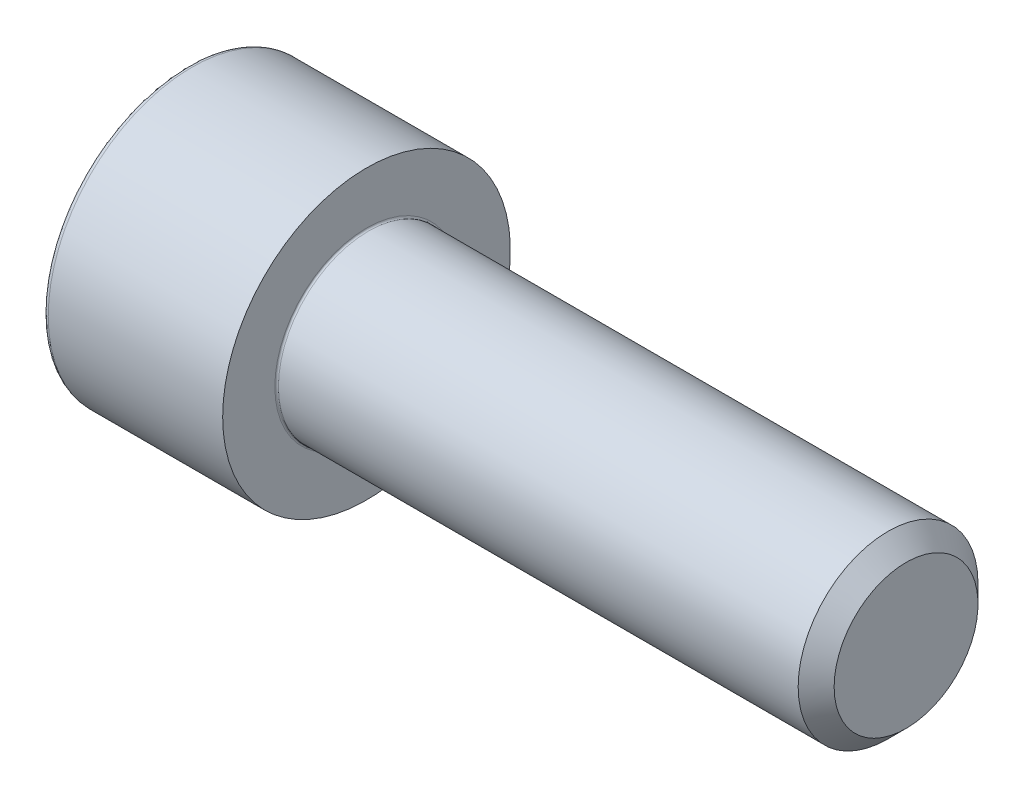
ISO-10303-21;
HEADER;
FILE_DESCRIPTION(('STEP AP214'),'2;1');
FILE_NAME('part.step','',(''),(''),'','','');
FILE_SCHEMA(('AUTOMOTIVE_DESIGN { 1 0 10303 214 1 1 1 1 }'));
ENDSEC;
DATA;
#1=APPLICATION_CONTEXT('core data for automotive mechanical design processes');
#2=APPLICATION_PROTOCOL_DEFINITION('international standard','automotive_design',2000,#1);
#3=PRODUCT_CONTEXT('',#1,'mechanical');
#4=PRODUCT('Part','Part','',(#3));
#5=PRODUCT_RELATED_PRODUCT_CATEGORY('part','',(#4));
#6=PRODUCT_DEFINITION_FORMATION('','',#4);
#7=PRODUCT_DEFINITION_CONTEXT('part definition',#1,'design');
#8=PRODUCT_DEFINITION('design','',#6,#7);
#9=PRODUCT_DEFINITION_SHAPE('','',#8);
#10=(LENGTH_UNIT() NAMED_UNIT(*) SI_UNIT(.MILLI.,.METRE.));
#11=(NAMED_UNIT(*) PLANE_ANGLE_UNIT() SI_UNIT($,.RADIAN.));
#12=(NAMED_UNIT(*) SI_UNIT($,.STERADIAN.) SOLID_ANGLE_UNIT());
#13=UNCERTAINTY_MEASURE_WITH_UNIT(LENGTH_MEASURE(1.E-05),#10,'distance_accuracy_value','');
#14=(GEOMETRIC_REPRESENTATION_CONTEXT(3) GLOBAL_UNCERTAINTY_ASSIGNED_CONTEXT((#13)) GLOBAL_UNIT_ASSIGNED_CONTEXT((#10,
#11,#12)) REPRESENTATION_CONTEXT('',''));
#15=CARTESIAN_POINT('',(0.,0.,0.));
#16=DIRECTION('',(0.,0.,1.));
#17=DIRECTION('',(1.,0.,0.));
#18=AXIS2_PLACEMENT_3D('',#15,#16,#17);
#19=CARTESIAN_POINT('',(0.,0.,0.));
#20=DIRECTION('',(-1.,0.,0.));
#21=DIRECTION('',(0.,0.,1.));
#22=AXIS2_PLACEMENT_3D('',#19,#20,#21);
#23=PLANE('',#22);
#24=DIRECTION('',(0.,-0.499999999999999,0.866025403784439));
#25=VECTOR('',#24,1.);
#26=CARTESIAN_POINT('',(0.,4.618802153517,0.));
#27=LINE('',#26,#25);
#28=CARTESIAN_POINT('',(0.,4.618802153517,0.));
#29=VERTEX_POINT('',#28);
#30=CARTESIAN_POINT('',(0.,2.3094010767585,3.99999999999999));
#31=VERTEX_POINT('',#30);
#32=EDGE_CURVE('E260',#29,#31,#27,.T.);
#33=ORIENTED_EDGE('',*,*,#32,.T.);
#34=DIRECTION('',(0.,1.,0.));
#35=VECTOR('',#34,1.);
#36=CARTESIAN_POINT('',(0.,-2.3094010767585,4.));
#37=LINE('',#36,#35);
#38=CARTESIAN_POINT('',(0.,-2.3094010767585,4.));
#39=VERTEX_POINT('',#38);
#40=EDGE_CURVE('E132',#39,#31,#37,.T.);
#41=ORIENTED_EDGE('',*,*,#40,.F.);
#42=DIRECTION('',(0.,-0.500000000000001,-0.866025403784438));
#43=VECTOR('',#42,1.);
#44=CARTESIAN_POINT('',(0.,-2.3094010767585,4.));
#45=LINE('',#44,#43);
#46=CARTESIAN_POINT('',(0.,-4.61880215351701,0.));
#47=VERTEX_POINT('',#46);
#48=EDGE_CURVE('E263',#39,#47,#45,.T.);
#49=ORIENTED_EDGE('',*,*,#48,.T.);
#50=DIRECTION('',(0.,0.5,-0.866025403784439));
#51=VECTOR('',#50,1.);
#52=CARTESIAN_POINT('',(0.,-4.61880215351701,0.));
#53=LINE('',#52,#51);
#54=CARTESIAN_POINT('',(0.,-2.30940107675851,-4.));
#55=VERTEX_POINT('',#54);
#56=EDGE_CURVE('E266',#47,#55,#53,.T.);
#57=ORIENTED_EDGE('',*,*,#56,.T.);
#58=DIRECTION('',(0.,-1.,0.));
#59=VECTOR('',#58,1.);
#60=CARTESIAN_POINT('',(0.,2.30940107675849,-4.));
#61=LINE('',#60,#59);
#62=CARTESIAN_POINT('',(0.,2.30940107675849,-4.));
#63=VERTEX_POINT('',#62);
#64=EDGE_CURVE('E269',#63,#55,#61,.T.);
#65=ORIENTED_EDGE('',*,*,#64,.F.);
#66=DIRECTION('',(0.,-0.500000000000001,-0.866025403784438));
#67=VECTOR('',#66,1.);
#68=CARTESIAN_POINT('',(0.,4.618802153517,0.));
#69=LINE('',#68,#67);
#70=EDGE_CURVE('E127',#29,#63,#69,.T.);
#71=ORIENTED_EDGE('',*,*,#70,.F.);
#72=EDGE_LOOP('',(#33,#41,#49,#57,#65,#71));
#73=FACE_BOUND('',#72,.T.);
#74=CARTESIAN_POINT('',(0.,0.,0.));
#75=DIRECTION('',(-1.,0.,0.));
#76=DIRECTION('',(0.,0.,1.));
#77=AXIS2_PLACEMENT_3D('',#74,#75,#76);
#78=CIRCLE('',#77,7.7);
#79=CARTESIAN_POINT('',(0.,0.,7.7));
#80=VERTEX_POINT('',#79);
#81=EDGE_CURVE('E44',#80,#80,#78,.T.);
#82=ORIENTED_EDGE('',*,*,#81,.T.);
#83=EDGE_LOOP('',(#82));
#84=FACE_BOUND('',#83,.T.);
#85=ADVANCED_FACE('F36',(#73,#84),#23,.T.);
#86=CARTESIAN_POINT('',(-31.75,0.,0.));
#87=DIRECTION('',(-1.,0.,0.));
#88=DIRECTION('',(0.,0.,1.));
#89=AXIS2_PLACEMENT_3D('',#86,#87,#88);
#90=CYLINDRICAL_SURFACE('',#89,8.);
#91=CARTESIAN_POINT('',(0.300000000000002,0.,0.));
#92=DIRECTION('',(-1.,0.,0.));
#93=DIRECTION('',(0.,0.,1.));
#94=AXIS2_PLACEMENT_3D('',#91,#92,#93);
#95=CIRCLE('',#94,8.);
#96=CARTESIAN_POINT('',(0.300000000000002,0.,8.));
#97=VERTEX_POINT('',#96);
#98=EDGE_CURVE('E11',#97,#97,#95,.F.);
#99=ORIENTED_EDGE('',*,*,#98,.T.);
#100=EDGE_LOOP('',(#99));
#101=FACE_BOUND('',#100,.T.);
#102=CARTESIAN_POINT('',(10.,0.,0.));
#103=DIRECTION('',(-1.,0.,0.));
#104=DIRECTION('',(0.,0.,1.));
#105=AXIS2_PLACEMENT_3D('',#102,#103,#104);
#106=CIRCLE('',#105,8.);
#107=CARTESIAN_POINT('',(10.,0.,8.));
#108=VERTEX_POINT('',#107);
#109=EDGE_CURVE('E150',#108,#108,#106,.T.);
#110=ORIENTED_EDGE('',*,*,#109,.T.);
#111=EDGE_LOOP('',(#110));
#112=FACE_BOUND('',#111,.T.);
#113=ADVANCED_FACE('F174',(#101,#112),#90,.T.);
#114=CARTESIAN_POINT('',(10.,8.,0.));
#115=DIRECTION('',(1.,0.,0.));
#116=DIRECTION('',(0.,0.,-1.));
#117=AXIS2_PLACEMENT_3D('',#114,#115,#116);
#118=PLANE('',#117);
#119=CARTESIAN_POINT('',(10.,0.,0.));
#120=DIRECTION('',(1.,0.,0.));
#121=DIRECTION('',(0.,0.,-1.));
#122=AXIS2_PLACEMENT_3D('',#119,#120,#121);
#123=CIRCLE('',#122,5.09999999999997);
#124=CARTESIAN_POINT('',(10.,0.,-5.09999999999997));
#125=VERTEX_POINT('',#124);
#126=EDGE_CURVE('E153',#125,#125,#123,.F.);
#127=ORIENTED_EDGE('',*,*,#126,.T.);
#128=EDGE_LOOP('',(#127));
#129=FACE_BOUND('',#128,.T.);
#130=ORIENTED_EDGE('',*,*,#109,.F.);
#131=EDGE_LOOP('',(#130));
#132=FACE_BOUND('',#131,.T.);
#133=ADVANCED_FACE('F180',(#129,#132),#118,.T.);
#134=CARTESIAN_POINT('',(-31.75,0.,0.));
#135=DIRECTION('',(-1.,0.,0.));
#136=DIRECTION('',(0.,0.,1.));
#137=AXIS2_PLACEMENT_3D('',#134,#135,#136);
#138=CYLINDRICAL_SURFACE('',#137,4.99999999999997);
#139=CARTESIAN_POINT('',(10.1,0.,0.));
#140=DIRECTION('',(1.,0.,0.));
#141=DIRECTION('',(0.,0.,-1.));
#142=AXIS2_PLACEMENT_3D('',#139,#140,#141);
#143=CIRCLE('',#142,4.99999999999997);
#144=CARTESIAN_POINT('',(10.1,0.,-4.99999999999997));
#145=VERTEX_POINT('',#144);
#146=EDGE_CURVE('E156',#145,#145,#143,.T.);
#147=ORIENTED_EDGE('',*,*,#146,.T.);
#148=EDGE_LOOP('',(#147));
#149=FACE_BOUND('',#148,.T.);
#150=CARTESIAN_POINT('',(38.9999999999999,0.,0.));
#151=DIRECTION('',(-1.,0.,0.));
#152=DIRECTION('',(0.,0.,1.));
#153=AXIS2_PLACEMENT_3D('',#150,#151,#152);
#154=CIRCLE('',#153,4.99999999999994);
#155=CARTESIAN_POINT('',(38.9999999999999,0.,4.99999999999994));
#156=VERTEX_POINT('',#155);
#157=EDGE_CURVE('E147',#156,#156,#154,.T.);
#158=ORIENTED_EDGE('',*,*,#157,.T.);
#159=EDGE_LOOP('',(#158));
#160=FACE_BOUND('',#159,.T.);
#161=ADVANCED_FACE('F186',(#149,#160),#138,.T.);
#162=CARTESIAN_POINT('',(40.,0.,0.));
#163=DIRECTION('',(-1.,0.,0.));
#164=DIRECTION('',(0.,0.,1.));
#165=AXIS2_PLACEMENT_3D('',#162,#163,#164);
#166=CONICAL_SURFACE('',#165,4.,0.785398163397391);
#167=ORIENTED_EDGE('',*,*,#157,.F.);
#168=EDGE_LOOP('',(#167));
#169=FACE_BOUND('',#168,.T.);
#170=CARTESIAN_POINT('',(40.,0.,0.));
#171=DIRECTION('',(-1.,0.,0.));
#172=DIRECTION('',(0.,0.,1.));
#173=AXIS2_PLACEMENT_3D('',#170,#171,#172);
#174=CIRCLE('',#173,4.);
#175=CARTESIAN_POINT('',(40.,0.,4.));
#176=VERTEX_POINT('',#175);
#177=EDGE_CURVE('E143',#176,#176,#174,.T.);
#178=ORIENTED_EDGE('',*,*,#177,.T.);
#179=EDGE_LOOP('',(#178));
#180=FACE_BOUND('',#179,.T.);
#181=ADVANCED_FACE('F190',(#169,#180),#166,.T.);
#182=CARTESIAN_POINT('',(40.,4.,0.));
#183=DIRECTION('',(1.,0.,0.));
#184=DIRECTION('',(0.,0.,-1.));
#185=AXIS2_PLACEMENT_3D('',#182,#183,#184);
#186=PLANE('',#185);
#187=ORIENTED_EDGE('',*,*,#177,.F.);
#188=EDGE_LOOP('',(#187));
#189=FACE_BOUND('',#188,.T.);
#190=ADVANCED_FACE('F170',(#189),#186,.T.);
#191=CARTESIAN_POINT('',(10.1,0.,0.));
#192=DIRECTION('',(1.,0.,0.));
#193=DIRECTION('',(0.,0.,-1.));
#194=AXIS2_PLACEMENT_3D('',#191,#192,#193);
#195=TOROIDAL_SURFACE('',#194,5.09999999999997,0.1);
#196=ORIENTED_EDGE('',*,*,#146,.F.);
#197=EDGE_LOOP('',(#196));
#198=FACE_BOUND('',#197,.T.);
#199=ORIENTED_EDGE('',*,*,#126,.F.);
#200=EDGE_LOOP('',(#199));
#201=FACE_BOUND('',#200,.T.);
#202=ADVANCED_FACE('F163',(#198,#201),#195,.F.);
#203=CARTESIAN_POINT('',(0.300000000000002,0.,0.));
#204=DIRECTION('',(-1.,0.,0.));
#205=DIRECTION('',(0.,0.,1.));
#206=AXIS2_PLACEMENT_3D('',#203,#204,#205);
#207=TOROIDAL_SURFACE('',#206,7.7,0.3);
#208=ORIENTED_EDGE('',*,*,#98,.F.);
#209=EDGE_LOOP('',(#208));
#210=FACE_BOUND('',#209,.T.);
#211=ORIENTED_EDGE('',*,*,#81,.F.);
#212=EDGE_LOOP('',(#211));
#213=FACE_BOUND('',#212,.T.);
#214=ADVANCED_FACE('F38',(#210,#213),#207,.T.);
#215=CARTESIAN_POINT('',(1.3,4.618802153517,0.));
#216=DIRECTION('',(0.,-0.866025403784439,-0.499999999999999));
#217=DIRECTION('',(0.,0.499999999999999,-0.866025403784439));
#218=AXIS2_PLACEMENT_3D('',#215,#216,#217);
#219=PLANE('',#218);
#220=ORIENTED_EDGE('',*,*,#32,.F.);
#221=DIRECTION('',(-1.,0.,0.));
#222=VECTOR('',#221,1.);
#223=CARTESIAN_POINT('',(1.3,4.618802153517,0.));
#224=LINE('',#223,#222);
#225=CARTESIAN_POINT('',(1.3,4.618802153517,0.));
#226=VERTEX_POINT('',#225);
#227=EDGE_CURVE('E250',#226,#29,#224,.T.);
#228=ORIENTED_EDGE('',*,*,#227,.F.);
#229=DIRECTION('',(0.,-0.499999999999999,0.866025403784439));
#230=VECTOR('',#229,1.);
#231=CARTESIAN_POINT('',(1.3,4.618802153517,0.));
#232=LINE('',#231,#230);
#233=CARTESIAN_POINT('',(1.3,3.46410161513775,2.));
#234=VERTEX_POINT('',#233);
#235=EDGE_CURVE('E119',#226,#234,#232,.T.);
#236=ORIENTED_EDGE('',*,*,#235,.T.);
#237=CARTESIAN_POINT('',(1.3,2.3094010767585,3.99999999999999));
#238=VERTEX_POINT('',#237);
#239=EDGE_CURVE('E110',#234,#238,#232,.T.);
#240=ORIENTED_EDGE('',*,*,#239,.T.);
#241=DIRECTION('',(-1.,0.,0.));
#242=VECTOR('',#241,1.);
#243=CARTESIAN_POINT('',(1.3,2.3094010767585,3.99999999999999));
#244=LINE('',#243,#242);
#245=EDGE_CURVE('E124',#238,#31,#244,.T.);
#246=ORIENTED_EDGE('',*,*,#245,.T.);
#247=EDGE_LOOP('',(#220,#228,#236,#240,#246));
#248=FACE_BOUND('',#247,.T.);
#249=ADVANCED_FACE('F123',(#248),#219,.T.);
#250=CARTESIAN_POINT('',(1.3,-2.3094010767585,4.));
#251=DIRECTION('',(0.,0.,1.));
#252=DIRECTION('',(0.,-1.,0.));
#253=AXIS2_PLACEMENT_3D('',#250,#251,#252);
#254=PLANE('',#253);
#255=ORIENTED_EDGE('',*,*,#40,.T.);
#256=ORIENTED_EDGE('',*,*,#245,.F.);
#257=DIRECTION('',(0.,1.,0.));
#258=VECTOR('',#257,1.);
#259=CARTESIAN_POINT('',(1.3,-2.3094010767585,4.));
#260=LINE('',#259,#258);
#261=CARTESIAN_POINT('',(1.3,0.,4.));
#262=VERTEX_POINT('',#261);
#263=EDGE_CURVE('E107',#262,#238,#260,.T.);
#264=ORIENTED_EDGE('',*,*,#263,.F.);
#265=CARTESIAN_POINT('',(1.3,-2.3094010767585,4.));
#266=VERTEX_POINT('',#265);
#267=EDGE_CURVE('E118',#266,#262,#260,.T.);
#268=ORIENTED_EDGE('',*,*,#267,.F.);
#269=DIRECTION('',(-1.,0.,0.));
#270=VECTOR('',#269,1.);
#271=CARTESIAN_POINT('',(1.3,-2.3094010767585,4.));
#272=LINE('',#271,#270);
#273=EDGE_CURVE('E134',#266,#39,#272,.T.);
#274=ORIENTED_EDGE('',*,*,#273,.T.);
#275=EDGE_LOOP('',(#255,#256,#264,#268,#274));
#276=FACE_BOUND('',#275,.T.);
#277=ADVANCED_FACE('F129',(#276),#254,.F.);
#278=CARTESIAN_POINT('',(1.3,-2.3094010767585,4.));
#279=DIRECTION('',(0.,0.866025403784438,-0.500000000000001));
#280=DIRECTION('',(0.,0.500000000000001,0.866025403784438));
#281=AXIS2_PLACEMENT_3D('',#278,#279,#280);
#282=PLANE('',#281);
#283=ORIENTED_EDGE('',*,*,#48,.F.);
#284=ORIENTED_EDGE('',*,*,#273,.F.);
#285=DIRECTION('',(0.,-0.500000000000001,-0.866025403784438));
#286=VECTOR('',#285,1.);
#287=CARTESIAN_POINT('',(1.3,-2.3094010767585,4.));
#288=LINE('',#287,#286);
#289=CARTESIAN_POINT('',(1.3,-3.46410161513776,2.00000000000001));
#290=VERTEX_POINT('',#289);
#291=EDGE_CURVE('E289',#266,#290,#288,.T.);
#292=ORIENTED_EDGE('',*,*,#291,.T.);
#293=CARTESIAN_POINT('',(1.3,-4.61880215351701,0.));
#294=VERTEX_POINT('',#293);
#295=EDGE_CURVE('E278',#290,#294,#288,.T.);
#296=ORIENTED_EDGE('',*,*,#295,.T.);
#297=DIRECTION('',(-1.,0.,0.));
#298=VECTOR('',#297,1.);
#299=CARTESIAN_POINT('',(1.3,-4.61880215351701,0.));
#300=LINE('',#299,#298);
#301=EDGE_CURVE('E139',#294,#47,#300,.T.);
#302=ORIENTED_EDGE('',*,*,#301,.T.);
#303=EDGE_LOOP('',(#283,#284,#292,#296,#302));
#304=FACE_BOUND('',#303,.T.);
#305=ADVANCED_FACE('F204',(#304),#282,.T.);
#306=CARTESIAN_POINT('',(1.3,-4.61880215351701,0.));
#307=DIRECTION('',(0.,0.866025403784439,0.5));
#308=DIRECTION('',(0.,-0.5,0.866025403784439));
#309=AXIS2_PLACEMENT_3D('',#306,#307,#308);
#310=PLANE('',#309);
#311=ORIENTED_EDGE('',*,*,#56,.F.);
#312=ORIENTED_EDGE('',*,*,#301,.F.);
#313=DIRECTION('',(0.,0.5,-0.866025403784439));
#314=VECTOR('',#313,1.);
#315=CARTESIAN_POINT('',(1.3,-4.61880215351701,0.));
#316=LINE('',#315,#314);
#317=CARTESIAN_POINT('',(1.3,-3.46410161513776,-2.));
#318=VERTEX_POINT('',#317);
#319=EDGE_CURVE('E256',#294,#318,#316,.T.);
#320=ORIENTED_EDGE('',*,*,#319,.T.);
#321=CARTESIAN_POINT('',(1.3,-2.30940107675851,-4.));
#322=VERTEX_POINT('',#321);
#323=EDGE_CURVE('E288',#318,#322,#316,.T.);
#324=ORIENTED_EDGE('',*,*,#323,.T.);
#325=DIRECTION('',(-1.,0.,0.));
#326=VECTOR('',#325,1.);
#327=CARTESIAN_POINT('',(1.3,-2.30940107675851,-4.));
#328=LINE('',#327,#326);
#329=EDGE_CURVE('E249',#322,#55,#328,.T.);
#330=ORIENTED_EDGE('',*,*,#329,.T.);
#331=EDGE_LOOP('',(#311,#312,#320,#324,#330));
#332=FACE_BOUND('',#331,.T.);
#333=ADVANCED_FACE('F207',(#332),#310,.T.);
#334=CARTESIAN_POINT('',(1.3,2.30940107675849,-4.));
#335=DIRECTION('',(0.,0.,-1.));
#336=DIRECTION('',(0.,1.,0.));
#337=AXIS2_PLACEMENT_3D('',#334,#335,#336);
#338=PLANE('',#337);
#339=ORIENTED_EDGE('',*,*,#64,.T.);
#340=ORIENTED_EDGE('',*,*,#329,.F.);
#341=DIRECTION('',(0.,-1.,0.));
#342=VECTOR('',#341,1.);
#343=CARTESIAN_POINT('',(1.3,2.30940107675849,-4.));
#344=LINE('',#343,#342);
#345=CARTESIAN_POINT('',(1.3,0.,-4.));
#346=VERTEX_POINT('',#345);
#347=EDGE_CURVE('E253',#346,#322,#344,.T.);
#348=ORIENTED_EDGE('',*,*,#347,.F.);
#349=CARTESIAN_POINT('',(1.3,2.30940107675849,-4.));
#350=VERTEX_POINT('',#349);
#351=EDGE_CURVE('E51',#350,#346,#344,.T.);
#352=ORIENTED_EDGE('',*,*,#351,.F.);
#353=DIRECTION('',(-1.,0.,0.));
#354=VECTOR('',#353,1.);
#355=CARTESIAN_POINT('',(1.3,2.30940107675849,-4.));
#356=LINE('',#355,#354);
#357=EDGE_CURVE('E246',#350,#63,#356,.T.);
#358=ORIENTED_EDGE('',*,*,#357,.T.);
#359=EDGE_LOOP('',(#339,#340,#348,#352,#358));
#360=FACE_BOUND('',#359,.T.);
#361=ADVANCED_FACE('F211',(#360),#338,.F.);
#362=CARTESIAN_POINT('',(1.3,4.618802153517,0.));
#363=DIRECTION('',(0.,0.866025403784438,-0.500000000000001));
#364=DIRECTION('',(0.,0.500000000000001,0.866025403784438));
#365=AXIS2_PLACEMENT_3D('',#362,#363,#364);
#366=PLANE('',#365);
#367=ORIENTED_EDGE('',*,*,#70,.T.);
#368=ORIENTED_EDGE('',*,*,#357,.F.);
#369=DIRECTION('',(0.,-0.500000000000001,-0.866025403784438));
#370=VECTOR('',#369,1.);
#371=CARTESIAN_POINT('',(1.3,4.618802153517,0.));
#372=LINE('',#371,#370);
#373=CARTESIAN_POINT('',(1.3,3.46410161513775,-2.));
#374=VERTEX_POINT('',#373);
#375=EDGE_CURVE('E236',#374,#350,#372,.T.);
#376=ORIENTED_EDGE('',*,*,#375,.F.);
#377=EDGE_CURVE('E242',#226,#374,#372,.T.);
#378=ORIENTED_EDGE('',*,*,#377,.F.);
#379=ORIENTED_EDGE('',*,*,#227,.T.);
#380=EDGE_LOOP('',(#367,#368,#376,#378,#379));
#381=FACE_BOUND('',#380,.T.);
#382=ADVANCED_FACE('F215',(#381),#366,.F.);
#383=CARTESIAN_POINT('',(1.3,4.618802153517,0.));
#384=DIRECTION('',(1.,0.,0.));
#385=DIRECTION('',(0.,0.,-1.));
#386=AXIS2_PLACEMENT_3D('',#383,#384,#385);
#387=PLANE('',#386);
#388=ORIENTED_EDGE('',*,*,#347,.T.);
#389=ORIENTED_EDGE('',*,*,#323,.F.);
#390=CARTESIAN_POINT('',(1.3,0.,0.));
#391=DIRECTION('',(-1.,0.,0.));
#392=DIRECTION('',(0.,0.,1.));
#393=AXIS2_PLACEMENT_3D('',#390,#391,#392);
#394=CIRCLE('',#393,4.);
#395=EDGE_CURVE('E284',#346,#318,#394,.T.);
#396=ORIENTED_EDGE('',*,*,#395,.F.);
#397=EDGE_LOOP('',(#388,#389,#396));
#398=FACE_BOUND('',#397,.T.);
#399=ADVANCED_FACE('F219',(#398),#387,.F.);
#400=ORIENTED_EDGE('',*,*,#319,.F.);
#401=ORIENTED_EDGE('',*,*,#295,.F.);
#402=EDGE_CURVE('E137',#318,#290,#394,.T.);
#403=ORIENTED_EDGE('',*,*,#402,.F.);
#404=EDGE_LOOP('',(#400,#401,#403));
#405=FACE_BOUND('',#404,.T.);
#406=ADVANCED_FACE('F222',(#405),#387,.F.);
#407=ORIENTED_EDGE('',*,*,#291,.F.);
#408=ORIENTED_EDGE('',*,*,#267,.T.);
#409=EDGE_CURVE('E133',#290,#262,#394,.T.);
#410=ORIENTED_EDGE('',*,*,#409,.F.);
#411=EDGE_LOOP('',(#407,#408,#410));
#412=FACE_BOUND('',#411,.T.);
#413=ADVANCED_FACE('F227',(#412),#387,.F.);
#414=ORIENTED_EDGE('',*,*,#263,.T.);
#415=ORIENTED_EDGE('',*,*,#239,.F.);
#416=EDGE_CURVE('E113',#262,#234,#394,.T.);
#417=ORIENTED_EDGE('',*,*,#416,.F.);
#418=EDGE_LOOP('',(#414,#415,#417));
#419=FACE_BOUND('',#418,.T.);
#420=ADVANCED_FACE('F109',(#419),#387,.F.);
#421=ORIENTED_EDGE('',*,*,#235,.F.);
#422=ORIENTED_EDGE('',*,*,#377,.T.);
#423=EDGE_CURVE('E144',#234,#374,#394,.T.);
#424=ORIENTED_EDGE('',*,*,#423,.F.);
#425=EDGE_LOOP('',(#421,#422,#424));
#426=FACE_BOUND('',#425,.T.);
#427=ADVANCED_FACE('F230',(#426),#387,.F.);
#428=ORIENTED_EDGE('',*,*,#375,.T.);
#429=ORIENTED_EDGE('',*,*,#351,.T.);
#430=EDGE_CURVE('E239',#374,#346,#394,.T.);
#431=ORIENTED_EDGE('',*,*,#430,.F.);
#432=EDGE_LOOP('',(#428,#429,#431));
#433=FACE_BOUND('',#432,.T.);
#434=ADVANCED_FACE('F200',(#433),#387,.F.);
#435=CARTESIAN_POINT('',(1.3,0.,0.));
#436=DIRECTION('',(-1.,0.,0.));
#437=DIRECTION('',(0.,0.,1.));
#438=AXIS2_PLACEMENT_3D('',#435,#436,#437);
#439=CONICAL_SURFACE('',#438,4.,1.04719755119659);
#440=CARTESIAN_POINT('',(3.60940107675854,0.,0.));
#441=VERTEX_POINT('',#440);
#442=VERTEX_LOOP('',#441);
#443=FACE_BOUND('',#442,.T.);
#444=ORIENTED_EDGE('',*,*,#416,.T.);
#445=ORIENTED_EDGE('',*,*,#423,.T.);
#446=ORIENTED_EDGE('',*,*,#430,.T.);
#447=ORIENTED_EDGE('',*,*,#395,.T.);
#448=ORIENTED_EDGE('',*,*,#402,.T.);
#449=ORIENTED_EDGE('',*,*,#409,.T.);
#450=EDGE_LOOP('',(#444,#445,#446,#447,#448,#449));
#451=FACE_BOUND('',#450,.T.);
#452=ADVANCED_FACE('F198',(#443,#451),#439,.F.);
#453=CLOSED_SHELL('',(#85,#113,#133,#161,#181,#190,#202,#214,#249,#277,#305,#333,#361,#382,#399,
#406,#413,#420,#427,#434,#452));
#454=MANIFOLD_SOLID_BREP('B2',#453);
#455=ADVANCED_BREP_SHAPE_REPRESENTATION('',(#18,#454),#14);
#456=SHAPE_DEFINITION_REPRESENTATION(#9,#455);
ENDSEC;
END-ISO-10303-21;
